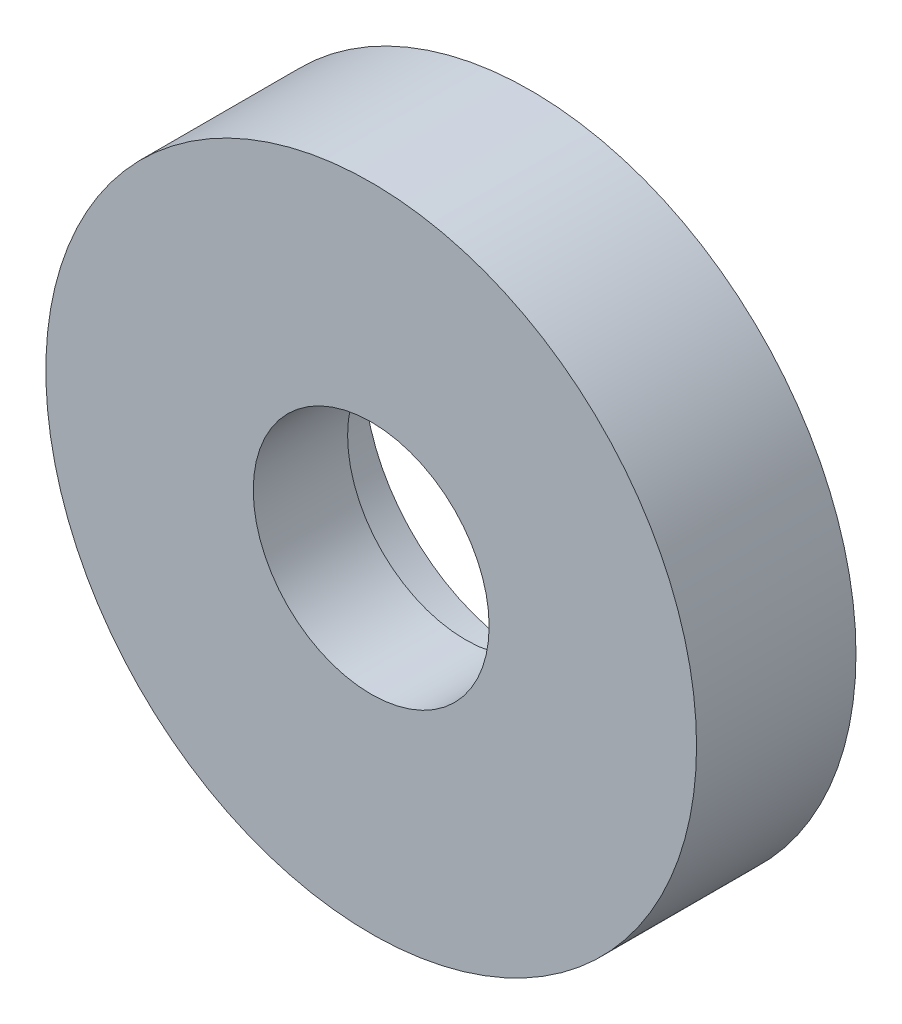
ISO-10303-21;
HEADER;
FILE_DESCRIPTION(('STEP AP214'),'2;1');
FILE_NAME('part.step','',(''),(''),'','','');
FILE_SCHEMA(('AUTOMOTIVE_DESIGN { 1 0 10303 214 1 1 1 1 }'));
ENDSEC;
DATA;
#1=APPLICATION_CONTEXT('core data for automotive mechanical design processes');
#2=APPLICATION_PROTOCOL_DEFINITION('international standard','automotive_design',2000,#1);
#3=PRODUCT_CONTEXT('',#1,'mechanical');
#4=PRODUCT('Part','Part','',(#3));
#5=PRODUCT_RELATED_PRODUCT_CATEGORY('part','',(#4));
#6=PRODUCT_DEFINITION_FORMATION('','',#4);
#7=PRODUCT_DEFINITION_CONTEXT('part definition',#1,'design');
#8=PRODUCT_DEFINITION('design','',#6,#7);
#9=PRODUCT_DEFINITION_SHAPE('','',#8);
#10=(LENGTH_UNIT() NAMED_UNIT(*) SI_UNIT(.MILLI.,.METRE.));
#11=(NAMED_UNIT(*) PLANE_ANGLE_UNIT() SI_UNIT($,.RADIAN.));
#12=(NAMED_UNIT(*) SI_UNIT($,.STERADIAN.) SOLID_ANGLE_UNIT());
#13=UNCERTAINTY_MEASURE_WITH_UNIT(LENGTH_MEASURE(1.E-05),#10,'distance_accuracy_value','');
#14=(GEOMETRIC_REPRESENTATION_CONTEXT(3) GLOBAL_UNCERTAINTY_ASSIGNED_CONTEXT((#13)) GLOBAL_UNIT_ASSIGNED_CONTEXT((#10,
#11,#12)) REPRESENTATION_CONTEXT('',''));
#15=CARTESIAN_POINT('',(0.,0.,0.));
#16=DIRECTION('',(0.,0.,1.));
#17=DIRECTION('',(1.,0.,0.));
#18=AXIS2_PLACEMENT_3D('',#15,#16,#17);
#19=CARTESIAN_POINT('',(0.,0.,9.8));
#20=DIRECTION('',(0.,0.,-1.));
#21=DIRECTION('',(-1.,0.,0.));
#22=AXIS2_PLACEMENT_3D('',#19,#20,#21);
#23=CYLINDRICAL_SURFACE('',#22,7.25);
#24=CARTESIAN_POINT('',(0.,0.,9.8));
#25=DIRECTION('',(0.,0.,1.));
#26=DIRECTION('',(1.,0.,0.));
#27=AXIS2_PLACEMENT_3D('',#24,#25,#26);
#28=CIRCLE('',#27,7.25);
#29=CARTESIAN_POINT('',(7.25,0.,9.8));
#30=VERTEX_POINT('',#29);
#31=EDGE_CURVE('E58',#30,#30,#28,.T.);
#32=ORIENTED_EDGE('',*,*,#31,.T.);
#33=EDGE_LOOP('',(#32));
#34=FACE_BOUND('',#33,.T.);
#35=CARTESIAN_POINT('',(0.,0.,4.));
#36=DIRECTION('',(0.,0.,-1.));
#37=DIRECTION('',(-1.,0.,0.));
#38=AXIS2_PLACEMENT_3D('',#35,#36,#37);
#39=CIRCLE('',#38,7.25);
#40=CARTESIAN_POINT('',(-7.25,0.,4.));
#41=VERTEX_POINT('',#40);
#42=EDGE_CURVE('E47',#41,#41,#39,.T.);
#43=ORIENTED_EDGE('',*,*,#42,.T.);
#44=EDGE_LOOP('',(#43));
#45=FACE_BOUND('',#44,.T.);
#46=ADVANCED_FACE('F43',(#34,#45),#23,.F.);
#47=CARTESIAN_POINT('',(0.,0.,9.8));
#48=DIRECTION('',(0.,0.,1.));
#49=DIRECTION('',(1.,0.,0.));
#50=AXIS2_PLACEMENT_3D('',#47,#48,#49);
#51=PLANE('',#50);
#52=CARTESIAN_POINT('',(0.,0.,9.8));
#53=DIRECTION('',(0.,0.,1.));
#54=DIRECTION('',(1.,0.,0.));
#55=AXIS2_PLACEMENT_3D('',#52,#53,#54);
#56=CIRCLE('',#55,20.);
#57=CARTESIAN_POINT('',(20.,0.,9.8));
#58=VERTEX_POINT('',#57);
#59=EDGE_CURVE('E10',#58,#58,#56,.T.);
#60=ORIENTED_EDGE('',*,*,#59,.T.);
#61=EDGE_LOOP('',(#60));
#62=FACE_BOUND('',#61,.T.);
#63=ORIENTED_EDGE('',*,*,#31,.F.);
#64=EDGE_LOOP('',(#63));
#65=FACE_BOUND('',#64,.T.);
#66=ADVANCED_FACE('F87',(#62,#65),#51,.T.);
#67=CARTESIAN_POINT('',(0.,0.,0.));
#68=DIRECTION('',(0.,0.,1.));
#69=DIRECTION('',(1.,0.,0.));
#70=AXIS2_PLACEMENT_3D('',#67,#68,#69);
#71=PLANE('',#70);
#72=CARTESIAN_POINT('',(0.,0.,0.));
#73=DIRECTION('',(0.,0.,-1.));
#74=DIRECTION('',(-1.,0.,0.));
#75=AXIS2_PLACEMENT_3D('',#72,#73,#74);
#76=CIRCLE('',#75,10.25);
#77=CARTESIAN_POINT('',(-10.25,0.,0.));
#78=VERTEX_POINT('',#77);
#79=EDGE_CURVE('E63',#78,#78,#76,.T.);
#80=ORIENTED_EDGE('',*,*,#79,.F.);
#81=EDGE_LOOP('',(#80));
#82=FACE_BOUND('',#81,.T.);
#83=CARTESIAN_POINT('',(0.,0.,0.));
#84=DIRECTION('',(0.,0.,1.));
#85=DIRECTION('',(1.,0.,0.));
#86=AXIS2_PLACEMENT_3D('',#83,#84,#85);
#87=CIRCLE('',#86,20.);
#88=CARTESIAN_POINT('',(20.,0.,0.));
#89=VERTEX_POINT('',#88);
#90=EDGE_CURVE('E52',#89,#89,#87,.T.);
#91=ORIENTED_EDGE('',*,*,#90,.F.);
#92=EDGE_LOOP('',(#91));
#93=FACE_BOUND('',#92,.T.);
#94=ADVANCED_FACE('F95',(#82,#93),#71,.F.);
#95=CARTESIAN_POINT('',(0.,0.,9.8));
#96=DIRECTION('',(0.,0.,-1.));
#97=DIRECTION('',(-1.,0.,0.));
#98=AXIS2_PLACEMENT_3D('',#95,#96,#97);
#99=CYLINDRICAL_SURFACE('',#98,20.);
#100=ORIENTED_EDGE('',*,*,#59,.F.);
#101=EDGE_LOOP('',(#100));
#102=FACE_BOUND('',#101,.T.);
#103=ORIENTED_EDGE('',*,*,#90,.T.);
#104=EDGE_LOOP('',(#103));
#105=FACE_BOUND('',#104,.T.);
#106=ADVANCED_FACE('F45',(#102,#105),#99,.T.);
#107=CARTESIAN_POINT('',(0.,0.,4.));
#108=DIRECTION('',(0.,0.,-1.));
#109=DIRECTION('',(-1.,0.,0.));
#110=AXIS2_PLACEMENT_3D('',#107,#108,#109);
#111=CYLINDRICAL_SURFACE('',#110,10.25);
#112=CARTESIAN_POINT('',(0.,0.,4.));
#113=DIRECTION('',(0.,0.,-1.));
#114=DIRECTION('',(-1.,0.,0.));
#115=AXIS2_PLACEMENT_3D('',#112,#113,#114);
#116=CIRCLE('',#115,10.25);
#117=CARTESIAN_POINT('',(-10.25,0.,4.));
#118=VERTEX_POINT('',#117);
#119=EDGE_CURVE('E67',#118,#118,#116,.T.);
#120=ORIENTED_EDGE('',*,*,#119,.F.);
#121=EDGE_LOOP('',(#120));
#122=FACE_BOUND('',#121,.T.);
#123=ORIENTED_EDGE('',*,*,#79,.T.);
#124=EDGE_LOOP('',(#123));
#125=FACE_BOUND('',#124,.T.);
#126=ADVANCED_FACE('F79',(#122,#125),#111,.F.);
#127=CARTESIAN_POINT('',(0.,0.,4.));
#128=DIRECTION('',(0.,0.,-1.));
#129=DIRECTION('',(-1.,0.,0.));
#130=AXIS2_PLACEMENT_3D('',#127,#128,#129);
#131=PLANE('',#130);
#132=ORIENTED_EDGE('',*,*,#42,.F.);
#133=EDGE_LOOP('',(#132));
#134=FACE_BOUND('',#133,.T.);
#135=ORIENTED_EDGE('',*,*,#119,.T.);
#136=EDGE_LOOP('',(#135));
#137=FACE_BOUND('',#136,.T.);
#138=ADVANCED_FACE('F77',(#134,#137),#131,.T.);
#139=CLOSED_SHELL('',(#46,#66,#94,#106,#126,#138));
#140=MANIFOLD_SOLID_BREP('B2',#139);
#141=ADVANCED_BREP_SHAPE_REPRESENTATION('',(#18,#140),#14);
#142=SHAPE_DEFINITION_REPRESENTATION(#9,#141);
ENDSEC;
END-ISO-10303-21;
